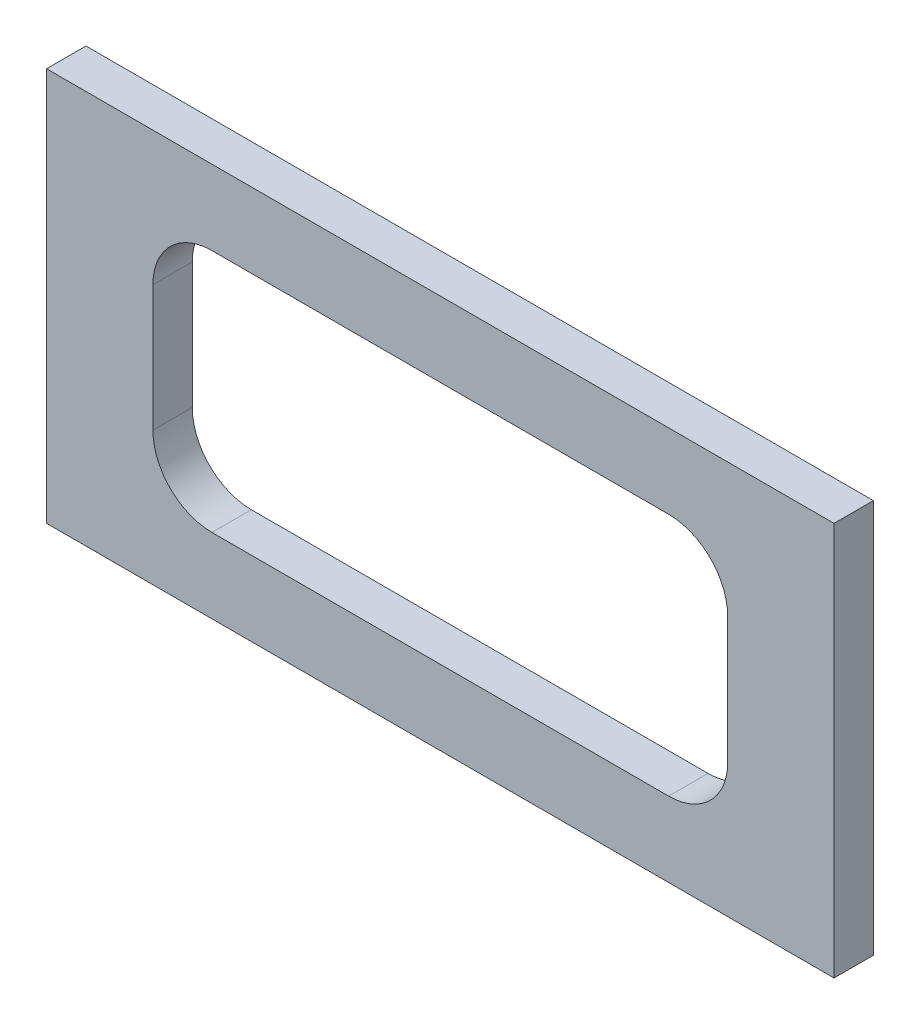
ISO-10303-21;
HEADER;
FILE_DESCRIPTION(('STEP AP214'),'2;1');
FILE_NAME('part.step','',(''),(''),'','','');
FILE_SCHEMA(('AUTOMOTIVE_DESIGN { 1 0 10303 214 1 1 1 1 }'));
ENDSEC;
DATA;
#1=APPLICATION_CONTEXT('core data for automotive mechanical design processes');
#2=APPLICATION_PROTOCOL_DEFINITION('international standard','automotive_design',2000,#1);
#3=PRODUCT_CONTEXT('',#1,'mechanical');
#4=PRODUCT('Part','Part','',(#3));
#5=PRODUCT_RELATED_PRODUCT_CATEGORY('part','',(#4));
#6=PRODUCT_DEFINITION_FORMATION('','',#4);
#7=PRODUCT_DEFINITION_CONTEXT('part definition',#1,'design');
#8=PRODUCT_DEFINITION('design','',#6,#7);
#9=PRODUCT_DEFINITION_SHAPE('','',#8);
#10=(LENGTH_UNIT() NAMED_UNIT(*) SI_UNIT(.MILLI.,.METRE.));
#11=(NAMED_UNIT(*) PLANE_ANGLE_UNIT() SI_UNIT($,.RADIAN.));
#12=(NAMED_UNIT(*) SI_UNIT($,.STERADIAN.) SOLID_ANGLE_UNIT());
#13=UNCERTAINTY_MEASURE_WITH_UNIT(LENGTH_MEASURE(1.E-05),#10,'distance_accuracy_value','');
#14=(GEOMETRIC_REPRESENTATION_CONTEXT(3) GLOBAL_UNCERTAINTY_ASSIGNED_CONTEXT((#13)) GLOBAL_UNIT_ASSIGNED_CONTEXT((#10,
#11,#12)) REPRESENTATION_CONTEXT('',''));
#15=CARTESIAN_POINT('',(0.,0.,0.));
#16=DIRECTION('',(0.,0.,1.));
#17=DIRECTION('',(1.,0.,0.));
#18=AXIS2_PLACEMENT_3D('',#15,#16,#17);
#19=CARTESIAN_POINT('',(0.,0.,5.));
#20=DIRECTION('',(1.,0.,0.));
#21=DIRECTION('',(0.,0.,-1.));
#22=AXIS2_PLACEMENT_3D('',#19,#20,#21);
#23=PLANE('',#22);
#24=DIRECTION('',(0.,-1.,0.));
#25=VECTOR('',#24,1.);
#26=CARTESIAN_POINT('',(0.,0.,0.));
#27=LINE('',#26,#25);
#28=CARTESIAN_POINT('',(0.,50.,0.));
#29=VERTEX_POINT('',#28);
#30=CARTESIAN_POINT('',(0.,0.,0.));
#31=VERTEX_POINT('',#30);
#32=EDGE_CURVE('E202',#29,#31,#27,.T.);
#33=ORIENTED_EDGE('',*,*,#32,.T.);
#34=DIRECTION('',(0.,0.,-1.));
#35=VECTOR('',#34,1.);
#36=CARTESIAN_POINT('',(0.,0.,5.));
#37=LINE('',#36,#35);
#38=CARTESIAN_POINT('',(0.,0.,5.));
#39=VERTEX_POINT('',#38);
#40=EDGE_CURVE('E11',#39,#31,#37,.T.);
#41=ORIENTED_EDGE('',*,*,#40,.F.);
#42=DIRECTION('',(0.,-1.,0.));
#43=VECTOR('',#42,1.);
#44=CARTESIAN_POINT('',(0.,0.,5.));
#45=LINE('',#44,#43);
#46=CARTESIAN_POINT('',(0.,50.,5.));
#47=VERTEX_POINT('',#46);
#48=EDGE_CURVE('E220',#47,#39,#45,.T.);
#49=ORIENTED_EDGE('',*,*,#48,.F.);
#50=DIRECTION('',(0.,0.,-1.));
#51=VECTOR('',#50,1.);
#52=CARTESIAN_POINT('',(0.,50.,5.));
#53=LINE('',#52,#51);
#54=EDGE_CURVE('E234',#47,#29,#53,.T.);
#55=ORIENTED_EDGE('',*,*,#54,.T.);
#56=EDGE_LOOP('',(#33,#41,#49,#55));
#57=FACE_BOUND('',#56,.T.);
#58=ADVANCED_FACE('F38',(#57),#23,.F.);
#59=CARTESIAN_POINT('',(0.,0.,5.));
#60=DIRECTION('',(0.,1.,0.));
#61=DIRECTION('',(0.,0.,1.));
#62=AXIS2_PLACEMENT_3D('',#59,#60,#61);
#63=PLANE('',#62);
#64=DIRECTION('',(1.,0.,0.));
#65=VECTOR('',#64,1.);
#66=CARTESIAN_POINT('',(0.,0.,0.));
#67=LINE('',#66,#65);
#68=CARTESIAN_POINT('',(100.,0.,0.));
#69=VERTEX_POINT('',#68);
#70=EDGE_CURVE('E238',#31,#69,#67,.T.);
#71=ORIENTED_EDGE('',*,*,#70,.T.);
#72=DIRECTION('',(0.,0.,-1.));
#73=VECTOR('',#72,1.);
#74=CARTESIAN_POINT('',(100.,0.,5.));
#75=LINE('',#74,#73);
#76=CARTESIAN_POINT('',(100.,0.,5.));
#77=VERTEX_POINT('',#76);
#78=EDGE_CURVE('E46',#77,#69,#75,.T.);
#79=ORIENTED_EDGE('',*,*,#78,.F.);
#80=DIRECTION('',(1.,0.,0.));
#81=VECTOR('',#80,1.);
#82=CARTESIAN_POINT('',(0.,0.,5.));
#83=LINE('',#82,#81);
#84=EDGE_CURVE('E224',#39,#77,#83,.T.);
#85=ORIENTED_EDGE('',*,*,#84,.F.);
#86=ORIENTED_EDGE('',*,*,#40,.T.);
#87=EDGE_LOOP('',(#71,#79,#85,#86));
#88=FACE_BOUND('',#87,.T.);
#89=ADVANCED_FACE('F272',(#88),#63,.F.);
#90=CARTESIAN_POINT('',(100.,0.,5.));
#91=DIRECTION('',(-1.,0.,0.));
#92=DIRECTION('',(0.,0.,1.));
#93=AXIS2_PLACEMENT_3D('',#90,#91,#92);
#94=PLANE('',#93);
#95=DIRECTION('',(0.,1.,0.));
#96=VECTOR('',#95,1.);
#97=CARTESIAN_POINT('',(100.,0.,0.));
#98=LINE('',#97,#96);
#99=CARTESIAN_POINT('',(100.,50.,0.));
#100=VERTEX_POINT('',#99);
#101=EDGE_CURVE('E241',#69,#100,#98,.T.);
#102=ORIENTED_EDGE('',*,*,#101,.T.);
#103=DIRECTION('',(0.,0.,-1.));
#104=VECTOR('',#103,1.);
#105=CARTESIAN_POINT('',(100.,50.,5.));
#106=LINE('',#105,#104);
#107=CARTESIAN_POINT('',(100.,50.,5.));
#108=VERTEX_POINT('',#107);
#109=EDGE_CURVE('E249',#108,#100,#106,.T.);
#110=ORIENTED_EDGE('',*,*,#109,.F.);
#111=DIRECTION('',(0.,1.,0.));
#112=VECTOR('',#111,1.);
#113=CARTESIAN_POINT('',(100.,0.,5.));
#114=LINE('',#113,#112);
#115=EDGE_CURVE('E228',#77,#108,#114,.T.);
#116=ORIENTED_EDGE('',*,*,#115,.F.);
#117=ORIENTED_EDGE('',*,*,#78,.T.);
#118=EDGE_LOOP('',(#102,#110,#116,#117));
#119=FACE_BOUND('',#118,.T.);
#120=ADVANCED_FACE('F258',(#119),#94,.F.);
#121=CARTESIAN_POINT('',(0.,50.,5.));
#122=DIRECTION('',(0.,-1.,0.));
#123=DIRECTION('',(0.,0.,-1.));
#124=AXIS2_PLACEMENT_3D('',#121,#122,#123);
#125=PLANE('',#124);
#126=DIRECTION('',(-1.,0.,0.));
#127=VECTOR('',#126,1.);
#128=CARTESIAN_POINT('',(0.,50.,0.));
#129=LINE('',#128,#127);
#130=EDGE_CURVE('E225',#100,#29,#129,.T.);
#131=ORIENTED_EDGE('',*,*,#130,.T.);
#132=ORIENTED_EDGE('',*,*,#54,.F.);
#133=DIRECTION('',(-1.,0.,0.));
#134=VECTOR('',#133,1.);
#135=CARTESIAN_POINT('',(0.,50.,5.));
#136=LINE('',#135,#134);
#137=EDGE_CURVE('E231',#108,#47,#136,.T.);
#138=ORIENTED_EDGE('',*,*,#137,.F.);
#139=ORIENTED_EDGE('',*,*,#109,.T.);
#140=EDGE_LOOP('',(#131,#132,#138,#139));
#141=FACE_BOUND('',#140,.T.);
#142=ADVANCED_FACE('F265',(#141),#125,.F.);
#143=CARTESIAN_POINT('',(0.,0.,5.));
#144=DIRECTION('',(0.,0.,-1.));
#145=DIRECTION('',(-1.,0.,0.));
#146=AXIS2_PLACEMENT_3D('',#143,#144,#145);
#147=PLANE('',#146);
#148=DIRECTION('',(1.,0.,0.));
#149=VECTOR('',#148,1.);
#150=CARTESIAN_POINT('',(21.,9.50000000000001,5.));
#151=LINE('',#150,#149);
#152=CARTESIAN_POINT('',(21.,9.50000000000001,5.));
#153=VERTEX_POINT('',#152);
#154=CARTESIAN_POINT('',(79.,9.50000000000001,5.));
#155=VERTEX_POINT('',#154);
#156=EDGE_CURVE('E177',#153,#155,#151,.T.);
#157=ORIENTED_EDGE('',*,*,#156,.F.);
#158=CARTESIAN_POINT('',(21.,17.,5.));
#159=DIRECTION('',(0.,0.,1.));
#160=DIRECTION('',(1.,0.,0.));
#161=AXIS2_PLACEMENT_3D('',#158,#159,#160);
#162=CIRCLE('',#161,7.5);
#163=CARTESIAN_POINT('',(13.5,17.,5.));
#164=VERTEX_POINT('',#163);
#165=EDGE_CURVE('E53',#164,#153,#162,.T.);
#166=ORIENTED_EDGE('',*,*,#165,.F.);
#167=DIRECTION('',(0.,-1.,0.));
#168=VECTOR('',#167,1.);
#169=CARTESIAN_POINT('',(13.5,33.,5.));
#170=LINE('',#169,#168);
#171=CARTESIAN_POINT('',(13.5,33.,5.));
#172=VERTEX_POINT('',#171);
#173=EDGE_CURVE('E149',#172,#164,#170,.T.);
#174=ORIENTED_EDGE('',*,*,#173,.F.);
#175=CARTESIAN_POINT('',(21.,33.,5.));
#176=DIRECTION('',(0.,0.,1.));
#177=DIRECTION('',(1.,0.,0.));
#178=AXIS2_PLACEMENT_3D('',#175,#176,#177);
#179=CIRCLE('',#178,7.5);
#180=CARTESIAN_POINT('',(21.,40.5,5.));
#181=VERTEX_POINT('',#180);
#182=EDGE_CURVE('E153',#181,#172,#179,.T.);
#183=ORIENTED_EDGE('',*,*,#182,.F.);
#184=DIRECTION('',(-1.,0.,0.));
#185=VECTOR('',#184,1.);
#186=CARTESIAN_POINT('',(21.,40.5,5.));
#187=LINE('',#186,#185);
#188=CARTESIAN_POINT('',(79.,40.5,5.));
#189=VERTEX_POINT('',#188);
#190=EDGE_CURVE('E192',#189,#181,#187,.T.);
#191=ORIENTED_EDGE('',*,*,#190,.F.);
#192=CARTESIAN_POINT('',(79.,33.,5.));
#193=DIRECTION('',(0.,0.,1.));
#194=DIRECTION('',(1.,0.,0.));
#195=AXIS2_PLACEMENT_3D('',#192,#193,#194);
#196=CIRCLE('',#195,7.50000000000001);
#197=CARTESIAN_POINT('',(86.5,33.,5.));
#198=VERTEX_POINT('',#197);
#199=EDGE_CURVE('E188',#198,#189,#196,.T.);
#200=ORIENTED_EDGE('',*,*,#199,.F.);
#201=DIRECTION('',(0.,1.,0.));
#202=VECTOR('',#201,1.);
#203=CARTESIAN_POINT('',(86.5,33.,5.));
#204=LINE('',#203,#202);
#205=CARTESIAN_POINT('',(86.5,17.,5.));
#206=VERTEX_POINT('',#205);
#207=EDGE_CURVE('E184',#206,#198,#204,.T.);
#208=ORIENTED_EDGE('',*,*,#207,.F.);
#209=CARTESIAN_POINT('',(79.,17.,5.));
#210=DIRECTION('',(0.,0.,1.));
#211=DIRECTION('',(1.,0.,0.));
#212=AXIS2_PLACEMENT_3D('',#209,#210,#211);
#213=CIRCLE('',#212,7.5);
#214=EDGE_CURVE('E180',#155,#206,#213,.T.);
#215=ORIENTED_EDGE('',*,*,#214,.F.);
#216=EDGE_LOOP('',(#157,#166,#174,#183,#191,#200,#208,#215));
#217=FACE_BOUND('',#216,.T.);
#218=ORIENTED_EDGE('',*,*,#48,.T.);
#219=ORIENTED_EDGE('',*,*,#84,.T.);
#220=ORIENTED_EDGE('',*,*,#115,.T.);
#221=ORIENTED_EDGE('',*,*,#137,.T.);
#222=EDGE_LOOP('',(#218,#219,#220,#221));
#223=FACE_BOUND('',#222,.T.);
#224=ADVANCED_FACE('F271',(#217,#223),#147,.F.);
#225=CARTESIAN_POINT('',(0.,0.,0.));
#226=DIRECTION('',(0.,0.,-1.));
#227=DIRECTION('',(-1.,0.,0.));
#228=AXIS2_PLACEMENT_3D('',#225,#226,#227);
#229=PLANE('',#228);
#230=CARTESIAN_POINT('',(21.,17.,0.));
#231=DIRECTION('',(0.,0.,1.));
#232=DIRECTION('',(1.,0.,0.));
#233=AXIS2_PLACEMENT_3D('',#230,#231,#232);
#234=CIRCLE('',#233,7.5);
#235=CARTESIAN_POINT('',(13.5,17.,0.));
#236=VERTEX_POINT('',#235);
#237=CARTESIAN_POINT('',(21.,9.50000000000001,0.));
#238=VERTEX_POINT('',#237);
#239=EDGE_CURVE('E129',#236,#238,#234,.T.);
#240=ORIENTED_EDGE('',*,*,#239,.T.);
#241=DIRECTION('',(1.,0.,0.));
#242=VECTOR('',#241,1.);
#243=CARTESIAN_POINT('',(21.,9.50000000000001,0.));
#244=LINE('',#243,#242);
#245=CARTESIAN_POINT('',(79.,9.50000000000001,0.));
#246=VERTEX_POINT('',#245);
#247=EDGE_CURVE('E139',#238,#246,#244,.T.);
#248=ORIENTED_EDGE('',*,*,#247,.T.);
#249=CARTESIAN_POINT('',(79.,17.,0.));
#250=DIRECTION('',(0.,0.,1.));
#251=DIRECTION('',(1.,0.,0.));
#252=AXIS2_PLACEMENT_3D('',#249,#250,#251);
#253=CIRCLE('',#252,7.5);
#254=CARTESIAN_POINT('',(86.5,17.,0.));
#255=VERTEX_POINT('',#254);
#256=EDGE_CURVE('E61',#246,#255,#253,.T.);
#257=ORIENTED_EDGE('',*,*,#256,.T.);
#258=DIRECTION('',(0.,1.,0.));
#259=VECTOR('',#258,1.);
#260=CARTESIAN_POINT('',(86.5,33.,0.));
#261=LINE('',#260,#259);
#262=CARTESIAN_POINT('',(86.5,33.,0.));
#263=VERTEX_POINT('',#262);
#264=EDGE_CURVE('E158',#255,#263,#261,.T.);
#265=ORIENTED_EDGE('',*,*,#264,.T.);
#266=CARTESIAN_POINT('',(79.,33.,0.));
#267=DIRECTION('',(0.,0.,1.));
#268=DIRECTION('',(1.,0.,0.));
#269=AXIS2_PLACEMENT_3D('',#266,#267,#268);
#270=CIRCLE('',#269,7.50000000000001);
#271=CARTESIAN_POINT('',(79.,40.5,0.));
#272=VERTEX_POINT('',#271);
#273=EDGE_CURVE('E162',#263,#272,#270,.T.);
#274=ORIENTED_EDGE('',*,*,#273,.T.);
#275=DIRECTION('',(-1.,0.,0.));
#276=VECTOR('',#275,1.);
#277=CARTESIAN_POINT('',(21.,40.5,0.));
#278=LINE('',#277,#276);
#279=CARTESIAN_POINT('',(21.,40.5,0.));
#280=VERTEX_POINT('',#279);
#281=EDGE_CURVE('E166',#272,#280,#278,.T.);
#282=ORIENTED_EDGE('',*,*,#281,.T.);
#283=CARTESIAN_POINT('',(21.,33.,0.));
#284=DIRECTION('',(0.,0.,1.));
#285=DIRECTION('',(1.,0.,0.));
#286=AXIS2_PLACEMENT_3D('',#283,#284,#285);
#287=CIRCLE('',#286,7.5);
#288=CARTESIAN_POINT('',(13.5,33.,0.));
#289=VERTEX_POINT('',#288);
#290=EDGE_CURVE('E170',#280,#289,#287,.T.);
#291=ORIENTED_EDGE('',*,*,#290,.T.);
#292=DIRECTION('',(0.,-1.,0.));
#293=VECTOR('',#292,1.);
#294=CARTESIAN_POINT('',(13.5,33.,0.));
#295=LINE('',#294,#293);
#296=EDGE_CURVE('E136',#289,#236,#295,.T.);
#297=ORIENTED_EDGE('',*,*,#296,.T.);
#298=EDGE_LOOP('',(#240,#248,#257,#265,#274,#282,#291,#297));
#299=FACE_BOUND('',#298,.T.);
#300=ORIENTED_EDGE('',*,*,#32,.F.);
#301=ORIENTED_EDGE('',*,*,#130,.F.);
#302=ORIENTED_EDGE('',*,*,#101,.F.);
#303=ORIENTED_EDGE('',*,*,#70,.F.);
#304=EDGE_LOOP('',(#300,#301,#302,#303));
#305=FACE_BOUND('',#304,.T.);
#306=ADVANCED_FACE('F144',(#299,#305),#229,.T.);
#307=CARTESIAN_POINT('',(21.,17.,0.));
#308=DIRECTION('',(0.,0.,1.));
#309=DIRECTION('',(1.,0.,0.));
#310=AXIS2_PLACEMENT_3D('',#307,#308,#309);
#311=CYLINDRICAL_SURFACE('',#310,7.5);
#312=ORIENTED_EDGE('',*,*,#165,.T.);
#313=DIRECTION('',(0.,0.,1.));
#314=VECTOR('',#313,1.);
#315=CARTESIAN_POINT('',(21.,9.50000000000001,0.));
#316=LINE('',#315,#314);
#317=EDGE_CURVE('E125',#238,#153,#316,.T.);
#318=ORIENTED_EDGE('',*,*,#317,.F.);
#319=ORIENTED_EDGE('',*,*,#239,.F.);
#320=DIRECTION('',(0.,0.,1.));
#321=VECTOR('',#320,1.);
#322=CARTESIAN_POINT('',(13.5,17.,0.));
#323=LINE('',#322,#321);
#324=EDGE_CURVE('E199',#236,#164,#323,.T.);
#325=ORIENTED_EDGE('',*,*,#324,.T.);
#326=EDGE_LOOP('',(#312,#318,#319,#325));
#327=FACE_BOUND('',#326,.T.);
#328=ADVANCED_FACE('F127',(#327),#311,.F.);
#329=CARTESIAN_POINT('',(13.5,33.,0.));
#330=DIRECTION('',(-1.,0.,0.));
#331=DIRECTION('',(0.,-1.,0.));
#332=AXIS2_PLACEMENT_3D('',#329,#330,#331);
#333=PLANE('',#332);
#334=ORIENTED_EDGE('',*,*,#173,.T.);
#335=ORIENTED_EDGE('',*,*,#324,.F.);
#336=ORIENTED_EDGE('',*,*,#296,.F.);
#337=DIRECTION('',(0.,0.,1.));
#338=VECTOR('',#337,1.);
#339=CARTESIAN_POINT('',(13.5,33.,0.));
#340=LINE('',#339,#338);
#341=EDGE_CURVE('E203',#289,#172,#340,.T.);
#342=ORIENTED_EDGE('',*,*,#341,.T.);
#343=EDGE_LOOP('',(#334,#335,#336,#342));
#344=FACE_BOUND('',#343,.T.);
#345=ADVANCED_FACE('F289',(#344),#333,.F.);
#346=CARTESIAN_POINT('',(21.,33.,0.));
#347=DIRECTION('',(0.,0.,1.));
#348=DIRECTION('',(1.,0.,0.));
#349=AXIS2_PLACEMENT_3D('',#346,#347,#348);
#350=CYLINDRICAL_SURFACE('',#349,7.5);
#351=ORIENTED_EDGE('',*,*,#182,.T.);
#352=ORIENTED_EDGE('',*,*,#341,.F.);
#353=ORIENTED_EDGE('',*,*,#290,.F.);
#354=DIRECTION('',(0.,0.,1.));
#355=VECTOR('',#354,1.);
#356=CARTESIAN_POINT('',(21.,40.5,0.));
#357=LINE('',#356,#355);
#358=EDGE_CURVE('E206',#280,#181,#357,.T.);
#359=ORIENTED_EDGE('',*,*,#358,.T.);
#360=EDGE_LOOP('',(#351,#352,#353,#359));
#361=FACE_BOUND('',#360,.T.);
#362=ADVANCED_FACE('F306',(#361),#350,.F.);
#363=CARTESIAN_POINT('',(21.,40.5,0.));
#364=DIRECTION('',(0.,1.,0.));
#365=DIRECTION('',(-1.,0.,0.));
#366=AXIS2_PLACEMENT_3D('',#363,#364,#365);
#367=PLANE('',#366);
#368=ORIENTED_EDGE('',*,*,#190,.T.);
#369=ORIENTED_EDGE('',*,*,#358,.F.);
#370=ORIENTED_EDGE('',*,*,#281,.F.);
#371=DIRECTION('',(0.,0.,1.));
#372=VECTOR('',#371,1.);
#373=CARTESIAN_POINT('',(79.,40.5,0.));
#374=LINE('',#373,#372);
#375=EDGE_CURVE('E209',#272,#189,#374,.T.);
#376=ORIENTED_EDGE('',*,*,#375,.T.);
#377=EDGE_LOOP('',(#368,#369,#370,#376));
#378=FACE_BOUND('',#377,.T.);
#379=ADVANCED_FACE('F302',(#378),#367,.F.);
#380=CARTESIAN_POINT('',(79.,33.,0.));
#381=DIRECTION('',(0.,0.,1.));
#382=DIRECTION('',(1.,0.,0.));
#383=AXIS2_PLACEMENT_3D('',#380,#381,#382);
#384=CYLINDRICAL_SURFACE('',#383,7.50000000000001);
#385=ORIENTED_EDGE('',*,*,#199,.T.);
#386=ORIENTED_EDGE('',*,*,#375,.F.);
#387=ORIENTED_EDGE('',*,*,#273,.F.);
#388=DIRECTION('',(0.,0.,1.));
#389=VECTOR('',#388,1.);
#390=CARTESIAN_POINT('',(86.5,33.,0.));
#391=LINE('',#390,#389);
#392=EDGE_CURVE('E212',#263,#198,#391,.T.);
#393=ORIENTED_EDGE('',*,*,#392,.T.);
#394=EDGE_LOOP('',(#385,#386,#387,#393));
#395=FACE_BOUND('',#394,.T.);
#396=ADVANCED_FACE('F298',(#395),#384,.F.);
#397=CARTESIAN_POINT('',(86.5,33.,0.));
#398=DIRECTION('',(1.,0.,0.));
#399=DIRECTION('',(0.,0.,-1.));
#400=AXIS2_PLACEMENT_3D('',#397,#398,#399);
#401=PLANE('',#400);
#402=ORIENTED_EDGE('',*,*,#207,.T.);
#403=ORIENTED_EDGE('',*,*,#392,.F.);
#404=ORIENTED_EDGE('',*,*,#264,.F.);
#405=DIRECTION('',(0.,0.,1.));
#406=VECTOR('',#405,1.);
#407=CARTESIAN_POINT('',(86.5,17.,0.));
#408=LINE('',#407,#406);
#409=EDGE_CURVE('E215',#255,#206,#408,.T.);
#410=ORIENTED_EDGE('',*,*,#409,.T.);
#411=EDGE_LOOP('',(#402,#403,#404,#410));
#412=FACE_BOUND('',#411,.T.);
#413=ADVANCED_FACE('F295',(#412),#401,.F.);
#414=CARTESIAN_POINT('',(79.,17.,0.));
#415=DIRECTION('',(0.,0.,1.));
#416=DIRECTION('',(1.,0.,0.));
#417=AXIS2_PLACEMENT_3D('',#414,#415,#416);
#418=CYLINDRICAL_SURFACE('',#417,7.5);
#419=ORIENTED_EDGE('',*,*,#214,.T.);
#420=ORIENTED_EDGE('',*,*,#409,.F.);
#421=ORIENTED_EDGE('',*,*,#256,.F.);
#422=DIRECTION('',(0.,0.,1.));
#423=VECTOR('',#422,1.);
#424=CARTESIAN_POINT('',(79.,9.50000000000001,0.));
#425=LINE('',#424,#423);
#426=EDGE_CURVE('E135',#246,#155,#425,.T.);
#427=ORIENTED_EDGE('',*,*,#426,.T.);
#428=EDGE_LOOP('',(#419,#420,#421,#427));
#429=FACE_BOUND('',#428,.T.);
#430=ADVANCED_FACE('F292',(#429),#418,.F.);
#431=CARTESIAN_POINT('',(21.,9.50000000000001,0.));
#432=DIRECTION('',(0.,-1.,0.));
#433=DIRECTION('',(0.,0.,-1.));
#434=AXIS2_PLACEMENT_3D('',#431,#432,#433);
#435=PLANE('',#434);
#436=ORIENTED_EDGE('',*,*,#156,.T.);
#437=ORIENTED_EDGE('',*,*,#426,.F.);
#438=ORIENTED_EDGE('',*,*,#247,.F.);
#439=ORIENTED_EDGE('',*,*,#317,.T.);
#440=EDGE_LOOP('',(#436,#437,#438,#439));
#441=FACE_BOUND('',#440,.T.);
#442=ADVANCED_FACE('F140',(#441),#435,.F.);
#443=CLOSED_SHELL('',(#58,#89,#120,#142,#224,#306,#328,#345,#362,#379,#396,#413,#430,#442));
#444=MANIFOLD_SOLID_BREP('B2',#443);
#445=ADVANCED_BREP_SHAPE_REPRESENTATION('',(#18,#444),#14);
#446=SHAPE_DEFINITION_REPRESENTATION(#9,#445);
ENDSEC;
END-ISO-10303-21;
